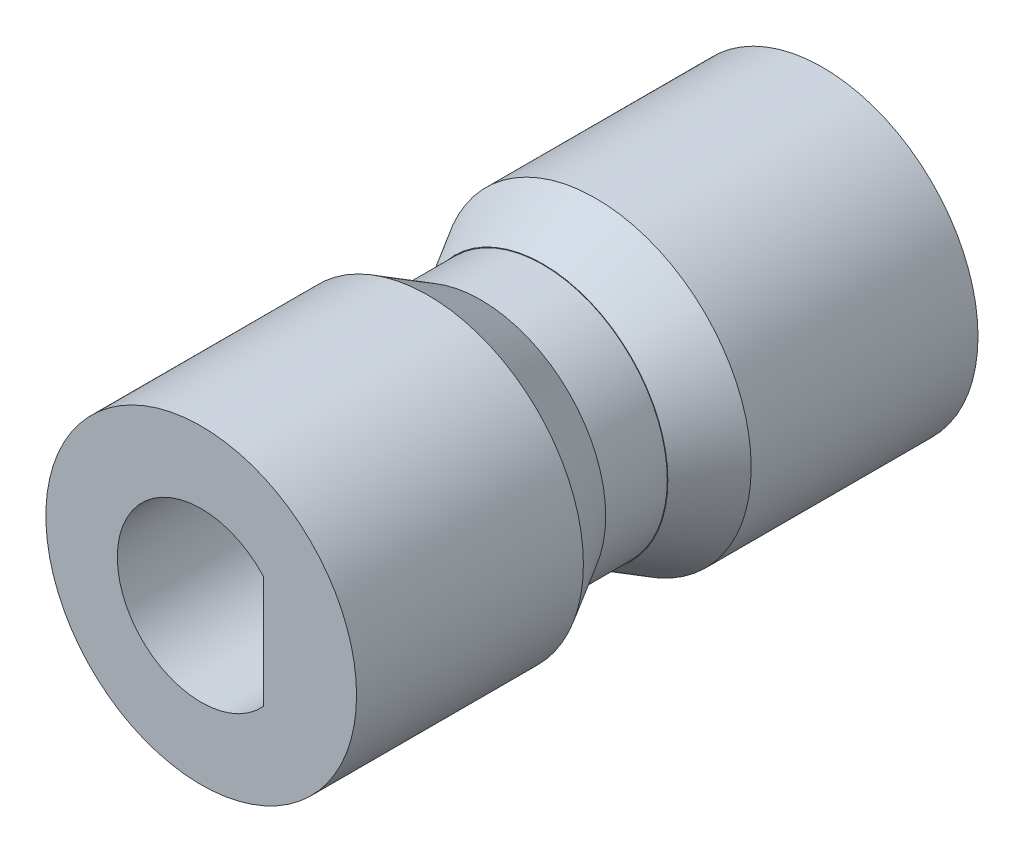
ISO-10303-21;
HEADER;
FILE_DESCRIPTION(('STEP AP214'),'2;1');
FILE_NAME('part.step','',(''),(''),'','','');
FILE_SCHEMA(('AUTOMOTIVE_DESIGN { 1 0 10303 214 1 1 1 1 }'));
ENDSEC;
DATA;
#1=APPLICATION_CONTEXT('core data for automotive mechanical design processes');
#2=APPLICATION_PROTOCOL_DEFINITION('international standard','automotive_design',2000,#1);
#3=PRODUCT_CONTEXT('',#1,'mechanical');
#4=PRODUCT('Part','Part','',(#3));
#5=PRODUCT_RELATED_PRODUCT_CATEGORY('part','',(#4));
#6=PRODUCT_DEFINITION_FORMATION('','',#4);
#7=PRODUCT_DEFINITION_CONTEXT('part definition',#1,'design');
#8=PRODUCT_DEFINITION('design','',#6,#7);
#9=PRODUCT_DEFINITION_SHAPE('','',#8);
#10=(LENGTH_UNIT() NAMED_UNIT(*) SI_UNIT(.MILLI.,.METRE.));
#11=(NAMED_UNIT(*) PLANE_ANGLE_UNIT() SI_UNIT($,.RADIAN.));
#12=(NAMED_UNIT(*) SI_UNIT($,.STERADIAN.) SOLID_ANGLE_UNIT());
#13=UNCERTAINTY_MEASURE_WITH_UNIT(LENGTH_MEASURE(1.E-05),#10,'distance_accuracy_value','');
#14=(GEOMETRIC_REPRESENTATION_CONTEXT(3) GLOBAL_UNCERTAINTY_ASSIGNED_CONTEXT((#13)) GLOBAL_UNIT_ASSIGNED_CONTEXT((#10,
#11,#12)) REPRESENTATION_CONTEXT('',''));
#15=CARTESIAN_POINT('',(0.,0.,0.));
#16=DIRECTION('',(0.,0.,1.));
#17=DIRECTION('',(1.,0.,0.));
#18=AXIS2_PLACEMENT_3D('',#15,#16,#17);
#19=CARTESIAN_POINT('',(0.,0.,0.));
#20=DIRECTION('',(0.,0.,1.));
#21=DIRECTION('',(1.,0.,0.));
#22=AXIS2_PLACEMENT_3D('',#19,#20,#21);
#23=PLANE('',#22);
#24=CARTESIAN_POINT('',(0.,0.,0.));
#25=DIRECTION('',(0.,0.,1.));
#26=DIRECTION('',(1.,0.,0.));
#27=AXIS2_PLACEMENT_3D('',#24,#25,#26);
#28=CIRCLE('',#27,5.);
#29=CARTESIAN_POINT('',(5.,0.,0.));
#30=VERTEX_POINT('',#29);
#31=EDGE_CURVE('E83',#30,#30,#28,.T.);
#32=ORIENTED_EDGE('',*,*,#31,.F.);
#33=EDGE_LOOP('',(#32));
#34=FACE_BOUND('',#33,.T.);
#35=CARTESIAN_POINT('',(0.,0.,0.));
#36=DIRECTION('',(0.,0.,1.));
#37=DIRECTION('',(1.,0.,0.));
#38=AXIS2_PLACEMENT_3D('',#35,#36,#37);
#39=CIRCLE('',#38,2.7);
#40=CARTESIAN_POINT('',(2.,1.81383571472171,0.));
#41=VERTEX_POINT('',#40);
#42=CARTESIAN_POINT('',(2.,-1.81383571472171,0.));
#43=VERTEX_POINT('',#42);
#44=EDGE_CURVE('E46',#41,#43,#39,.T.);
#45=ORIENTED_EDGE('',*,*,#44,.T.);
#46=DIRECTION('',(0.,1.,0.));
#47=VECTOR('',#46,1.);
#48=CARTESIAN_POINT('',(2.,1.81383571472171,0.));
#49=LINE('',#48,#47);
#50=EDGE_CURVE('E63',#43,#41,#49,.T.);
#51=ORIENTED_EDGE('',*,*,#50,.T.);
#52=EDGE_LOOP('',(#45,#51));
#53=FACE_BOUND('',#52,.T.);
#54=ADVANCED_FACE('F31',(#34,#53),#23,.F.);
#55=CARTESIAN_POINT('',(0.,0.,20.));
#56=DIRECTION('',(0.,0.,1.));
#57=DIRECTION('',(1.,0.,0.));
#58=AXIS2_PLACEMENT_3D('',#55,#56,#57);
#59=PLANE('',#58);
#60=CARTESIAN_POINT('',(0.,0.,20.));
#61=DIRECTION('',(0.,0.,1.));
#62=DIRECTION('',(1.,0.,0.));
#63=AXIS2_PLACEMENT_3D('',#60,#61,#62);
#64=CIRCLE('',#63,5.);
#65=CARTESIAN_POINT('',(5.,0.,20.));
#66=VERTEX_POINT('',#65);
#67=EDGE_CURVE('E69',#66,#66,#64,.T.);
#68=ORIENTED_EDGE('',*,*,#67,.T.);
#69=EDGE_LOOP('',(#68));
#70=FACE_BOUND('',#69,.T.);
#71=DIRECTION('',(0.,1.,0.));
#72=VECTOR('',#71,1.);
#73=CARTESIAN_POINT('',(2.,1.81383571472171,20.));
#74=LINE('',#73,#72);
#75=CARTESIAN_POINT('',(2.,-1.81383571472171,20.));
#76=VERTEX_POINT('',#75);
#77=CARTESIAN_POINT('',(2.,1.81383571472171,20.));
#78=VERTEX_POINT('',#77);
#79=EDGE_CURVE('E66',#76,#78,#74,.T.);
#80=ORIENTED_EDGE('',*,*,#79,.F.);
#81=CARTESIAN_POINT('',(0.,0.,20.));
#82=DIRECTION('',(0.,0.,1.));
#83=DIRECTION('',(1.,0.,0.));
#84=AXIS2_PLACEMENT_3D('',#81,#82,#83);
#85=CIRCLE('',#84,2.7);
#86=EDGE_CURVE('E51',#78,#76,#85,.T.);
#87=ORIENTED_EDGE('',*,*,#86,.F.);
#88=EDGE_LOOP('',(#80,#87));
#89=FACE_BOUND('',#88,.T.);
#90=ADVANCED_FACE('F71',(#70,#89),#59,.T.);
#91=CARTESIAN_POINT('',(0.,0.,9.));
#92=DIRECTION('',(0.,0.,1.));
#93=DIRECTION('',(1.,0.,0.));
#94=AXIS2_PLACEMENT_3D('',#91,#92,#93);
#95=PLANE('',#94);
#96=CARTESIAN_POINT('',(0.,0.,9.));
#97=DIRECTION('',(0.,0.,1.));
#98=DIRECTION('',(1.,0.,0.));
#99=AXIS2_PLACEMENT_3D('',#96,#97,#98);
#100=CIRCLE('',#99,4.01850454237764);
#101=CARTESIAN_POINT('',(4.01850454237764,0.,9.));
#102=VERTEX_POINT('',#101);
#103=EDGE_CURVE('E39',#102,#102,#100,.T.);
#104=ORIENTED_EDGE('',*,*,#103,.T.);
#105=EDGE_LOOP('',(#104));
#106=FACE_BOUND('',#105,.T.);
#107=CARTESIAN_POINT('',(0.,0.,9.));
#108=DIRECTION('',(0.,0.,1.));
#109=DIRECTION('',(1.,0.,0.));
#110=AXIS2_PLACEMENT_3D('',#107,#108,#109);
#111=CIRCLE('',#110,4.);
#112=CARTESIAN_POINT('',(4.,0.,9.));
#113=VERTEX_POINT('',#112);
#114=EDGE_CURVE('E79',#113,#113,#111,.T.);
#115=ORIENTED_EDGE('',*,*,#114,.F.);
#116=EDGE_LOOP('',(#115));
#117=FACE_BOUND('',#116,.T.);
#118=ADVANCED_FACE('F96',(#106,#117),#95,.T.);
#119=CARTESIAN_POINT('',(0.,0.,9.));
#120=DIRECTION('',(0.,0.,-1.));
#121=DIRECTION('',(-1.,0.,0.));
#122=AXIS2_PLACEMENT_3D('',#119,#120,#121);
#123=CYLINDRICAL_SURFACE('',#122,5.);
#124=CARTESIAN_POINT('',(0.,0.,7.29999999999999));
#125=DIRECTION('',(0.,0.,1.));
#126=DIRECTION('',(1.,0.,0.));
#127=AXIS2_PLACEMENT_3D('',#124,#125,#126);
#128=CIRCLE('',#127,5.);
#129=CARTESIAN_POINT('',(5.,0.,7.29999999999999));
#130=VERTEX_POINT('',#129);
#131=EDGE_CURVE('E11',#130,#130,#128,.F.);
#132=ORIENTED_EDGE('',*,*,#131,.T.);
#133=EDGE_LOOP('',(#132));
#134=FACE_BOUND('',#133,.T.);
#135=ORIENTED_EDGE('',*,*,#31,.T.);
#136=EDGE_LOOP('',(#135));
#137=FACE_BOUND('',#136,.T.);
#138=ADVANCED_FACE('F120',(#134,#137),#123,.T.);
#139=CARTESIAN_POINT('',(0.,0.,11.));
#140=DIRECTION('',(0.,0.,-1.));
#141=DIRECTION('',(-1.,0.,0.));
#142=AXIS2_PLACEMENT_3D('',#139,#140,#141);
#143=CYLINDRICAL_SURFACE('',#142,4.);
#144=CARTESIAN_POINT('',(0.,0.,11.));
#145=DIRECTION('',(0.,0.,1.));
#146=DIRECTION('',(1.,0.,0.));
#147=AXIS2_PLACEMENT_3D('',#144,#145,#146);
#148=CIRCLE('',#147,4.);
#149=CARTESIAN_POINT('',(4.,0.,11.));
#150=VERTEX_POINT('',#149);
#151=EDGE_CURVE('E80',#150,#150,#148,.T.);
#152=ORIENTED_EDGE('',*,*,#151,.F.);
#153=EDGE_LOOP('',(#152));
#154=FACE_BOUND('',#153,.T.);
#155=ORIENTED_EDGE('',*,*,#114,.T.);
#156=EDGE_LOOP('',(#155));
#157=FACE_BOUND('',#156,.T.);
#158=ADVANCED_FACE('F122',(#154,#157),#143,.T.);
#159=CARTESIAN_POINT('',(0.,0.,11.));
#160=DIRECTION('',(0.,0.,1.));
#161=DIRECTION('',(1.,0.,0.));
#162=AXIS2_PLACEMENT_3D('',#159,#160,#161);
#163=PLANE('',#162);
#164=CARTESIAN_POINT('',(0.,0.,11.));
#165=DIRECTION('',(0.,0.,1.));
#166=DIRECTION('',(1.,0.,0.));
#167=AXIS2_PLACEMENT_3D('',#164,#165,#166);
#168=CIRCLE('',#167,4.01850454237763);
#169=CARTESIAN_POINT('',(4.01850454237763,0.,11.));
#170=VERTEX_POINT('',#169);
#171=EDGE_CURVE('E91',#170,#170,#168,.F.);
#172=ORIENTED_EDGE('',*,*,#171,.T.);
#173=EDGE_LOOP('',(#172));
#174=FACE_BOUND('',#173,.T.);
#175=ORIENTED_EDGE('',*,*,#151,.T.);
#176=EDGE_LOOP('',(#175));
#177=FACE_BOUND('',#176,.T.);
#178=ADVANCED_FACE('F128',(#174,#177),#163,.F.);
#179=CARTESIAN_POINT('',(0.,0.,20.));
#180=DIRECTION('',(0.,0.,-1.));
#181=DIRECTION('',(-1.,0.,0.));
#182=AXIS2_PLACEMENT_3D('',#179,#180,#181);
#183=CYLINDRICAL_SURFACE('',#182,5.);
#184=CARTESIAN_POINT('',(0.,0.,12.7));
#185=DIRECTION('',(0.,0.,1.));
#186=DIRECTION('',(1.,0.,0.));
#187=AXIS2_PLACEMENT_3D('',#184,#185,#186);
#188=CIRCLE('',#187,5.);
#189=CARTESIAN_POINT('',(5.,0.,12.7));
#190=VERTEX_POINT('',#189);
#191=EDGE_CURVE('E88',#190,#190,#188,.T.);
#192=ORIENTED_EDGE('',*,*,#191,.T.);
#193=EDGE_LOOP('',(#192));
#194=FACE_BOUND('',#193,.T.);
#195=ORIENTED_EDGE('',*,*,#67,.F.);
#196=EDGE_LOOP('',(#195));
#197=FACE_BOUND('',#196,.T.);
#198=ADVANCED_FACE('F150',(#194,#197),#183,.T.);
#199=CARTESIAN_POINT('',(0.,0.,20.001));
#200=DIRECTION('',(0.,0.,-1.));
#201=DIRECTION('',(-1.,0.,0.));
#202=AXIS2_PLACEMENT_3D('',#199,#200,#201);
#203=CYLINDRICAL_SURFACE('',#202,2.7);
#204=ORIENTED_EDGE('',*,*,#86,.T.);
#205=DIRECTION('',(0.,0.,-1.));
#206=VECTOR('',#205,1.);
#207=CARTESIAN_POINT('',(2.,-1.81383571472171,20.001));
#208=LINE('',#207,#206);
#209=EDGE_CURVE('E62',#76,#43,#208,.T.);
#210=ORIENTED_EDGE('',*,*,#209,.T.);
#211=ORIENTED_EDGE('',*,*,#44,.F.);
#212=DIRECTION('',(0.,0.,-1.));
#213=VECTOR('',#212,1.);
#214=CARTESIAN_POINT('',(2.,1.81383571472171,20.001));
#215=LINE('',#214,#213);
#216=EDGE_CURVE('E56',#78,#41,#215,.T.);
#217=ORIENTED_EDGE('',*,*,#216,.F.);
#218=EDGE_LOOP('',(#204,#210,#211,#217));
#219=FACE_BOUND('',#218,.T.);
#220=ADVANCED_FACE('F58',(#219),#203,.F.);
#221=CARTESIAN_POINT('',(2.,1.81383571472171,20.001));
#222=DIRECTION('',(-1.,0.,0.));
#223=DIRECTION('',(0.,0.,1.));
#224=AXIS2_PLACEMENT_3D('',#221,#222,#223);
#225=PLANE('',#224);
#226=ORIENTED_EDGE('',*,*,#79,.T.);
#227=ORIENTED_EDGE('',*,*,#216,.T.);
#228=ORIENTED_EDGE('',*,*,#50,.F.);
#229=ORIENTED_EDGE('',*,*,#209,.F.);
#230=EDGE_LOOP('',(#226,#227,#228,#229));
#231=FACE_BOUND('',#230,.T.);
#232=ADVANCED_FACE('F67',(#231),#225,.T.);
#233=CARTESIAN_POINT('',(0.,0.,12.7));
#234=DIRECTION('',(0.,0.,1.));
#235=DIRECTION('',(1.,0.,0.));
#236=AXIS2_PLACEMENT_3D('',#233,#234,#235);
#237=CONICAL_SURFACE('',#236,5.,0.523598775598297);
#238=ORIENTED_EDGE('',*,*,#171,.F.);
#239=EDGE_LOOP('',(#238));
#240=FACE_BOUND('',#239,.T.);
#241=ORIENTED_EDGE('',*,*,#191,.F.);
#242=EDGE_LOOP('',(#241));
#243=FACE_BOUND('',#242,.T.);
#244=ADVANCED_FACE('F100',(#240,#243),#237,.T.);
#245=CARTESIAN_POINT('',(0.,0.,9.));
#246=DIRECTION('',(0.,0.,-1.));
#247=DIRECTION('',(-1.,0.,0.));
#248=AXIS2_PLACEMENT_3D('',#245,#246,#247);
#249=CONICAL_SURFACE('',#248,4.01850454237764,0.523598775598298);
#250=ORIENTED_EDGE('',*,*,#131,.F.);
#251=EDGE_LOOP('',(#250));
#252=FACE_BOUND('',#251,.T.);
#253=ORIENTED_EDGE('',*,*,#103,.F.);
#254=EDGE_LOOP('',(#253));
#255=FACE_BOUND('',#254,.T.);
#256=ADVANCED_FACE('F33',(#252,#255),#249,.T.);
#257=CLOSED_SHELL('',(#54,#90,#118,#138,#158,#178,#198,#220,#232,#244,#256));
#258=MANIFOLD_SOLID_BREP('B2',#257);
#259=ADVANCED_BREP_SHAPE_REPRESENTATION('',(#18,#258),#14);
#260=SHAPE_DEFINITION_REPRESENTATION(#9,#259);
ENDSEC;
END-ISO-10303-21;
